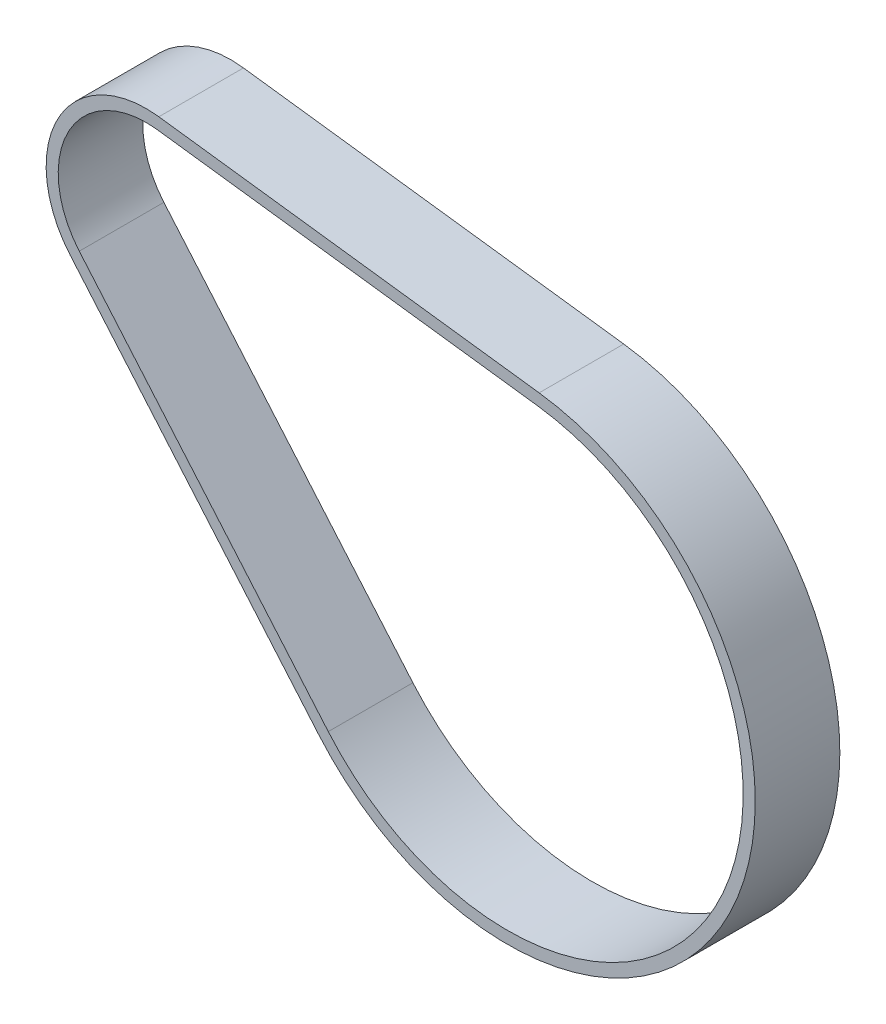
ISO-10303-21;
HEADER;
FILE_DESCRIPTION(('STEP AP214'),'2;1');
FILE_NAME('part.step','',(''),(''),'','','');
FILE_SCHEMA(('AUTOMOTIVE_DESIGN { 1 0 10303 214 1 1 1 1 }'));
ENDSEC;
DATA;
#1=APPLICATION_CONTEXT('core data for automotive mechanical design processes');
#2=APPLICATION_PROTOCOL_DEFINITION('international standard','automotive_design',2000,#1);
#3=PRODUCT_CONTEXT('',#1,'mechanical');
#4=PRODUCT('Part','Part','',(#3));
#5=PRODUCT_RELATED_PRODUCT_CATEGORY('part','',(#4));
#6=PRODUCT_DEFINITION_FORMATION('','',#4);
#7=PRODUCT_DEFINITION_CONTEXT('part definition',#1,'design');
#8=PRODUCT_DEFINITION('design','',#6,#7);
#9=PRODUCT_DEFINITION_SHAPE('','',#8);
#10=(LENGTH_UNIT() NAMED_UNIT(*) SI_UNIT(.MILLI.,.METRE.));
#11=(NAMED_UNIT(*) PLANE_ANGLE_UNIT() SI_UNIT($,.RADIAN.));
#12=(NAMED_UNIT(*) SI_UNIT($,.STERADIAN.) SOLID_ANGLE_UNIT());
#13=UNCERTAINTY_MEASURE_WITH_UNIT(LENGTH_MEASURE(1.E-05),#10,'distance_accuracy_value','');
#14=(GEOMETRIC_REPRESENTATION_CONTEXT(3) GLOBAL_UNCERTAINTY_ASSIGNED_CONTEXT((#13)) GLOBAL_UNIT_ASSIGNED_CONTEXT((#10,
#11,#12)) REPRESENTATION_CONTEXT('',''));
#15=CARTESIAN_POINT('',(0.,0.,0.));
#16=DIRECTION('',(0.,0.,1.));
#17=DIRECTION('',(1.,0.,0.));
#18=AXIS2_PLACEMENT_3D('',#15,#16,#17);
#19=CARTESIAN_POINT('',(2.61780495734741,20.3321690236258,-7.));
#20=DIRECTION('',(-0.127697802797435,-0.991813123103696,0.));
#21=DIRECTION('',(0.991813123103696,-0.127697802797435,0.));
#22=AXIS2_PLACEMENT_3D('',#19,#20,#21);
#23=PLANE('',#22);
#24=DIRECTION('',(0.991813123103696,-0.127697802797435,0.));
#25=VECTOR('',#24,1.);
#26=CARTESIAN_POINT('',(2.61780495734741,20.3321690236258,0.));
#27=LINE('',#26,#25);
#28=CARTESIAN_POINT('',(-28.8467078496831,24.3832841560573,0.));
#29=VERTEX_POINT('',#28);
#30=CARTESIAN_POINT('',(2.61780495734742,20.3321690236258,0.));
#31=VERTEX_POINT('',#30);
#32=EDGE_CURVE('E151',#29,#31,#27,.T.);
#33=ORIENTED_EDGE('',*,*,#32,.T.);
#34=DIRECTION('',(0.,0.,1.));
#35=VECTOR('',#34,1.);
#36=CARTESIAN_POINT('',(2.61780495734742,20.3321690236258,-7.));
#37=LINE('',#36,#35);
#38=CARTESIAN_POINT('',(2.61780495734742,20.3321690236258,-7.));
#39=VERTEX_POINT('',#38);
#40=EDGE_CURVE('E11',#39,#31,#37,.T.);
#41=ORIENTED_EDGE('',*,*,#40,.F.);
#42=DIRECTION('',(0.991813123103696,-0.127697802797435,0.));
#43=VECTOR('',#42,1.);
#44=CARTESIAN_POINT('',(2.61780495734741,20.3321690236258,-7.));
#45=LINE('',#44,#43);
#46=CARTESIAN_POINT('',(-28.8467078496831,24.3832841560573,-7.));
#47=VERTEX_POINT('',#46);
#48=EDGE_CURVE('E64',#47,#39,#45,.T.);
#49=ORIENTED_EDGE('',*,*,#48,.F.);
#50=DIRECTION('',(0.,0.,1.));
#51=VECTOR('',#50,1.);
#52=CARTESIAN_POINT('',(-28.8467078496831,24.3832841560573,-7.));
#53=LINE('',#52,#51);
#54=EDGE_CURVE('E127',#47,#29,#53,.T.);
#55=ORIENTED_EDGE('',*,*,#54,.T.);
#56=EDGE_LOOP('',(#33,#41,#49,#55));
#57=FACE_BOUND('',#56,.T.);
#58=ADVANCED_FACE('F45',(#57),#23,.F.);
#59=CARTESIAN_POINT('',(0.,0.,-7.));
#60=DIRECTION('',(0.,0.,1.));
#61=DIRECTION('',(1.,0.,0.));
#62=AXIS2_PLACEMENT_3D('',#59,#60,#61);
#63=CYLINDRICAL_SURFACE('',#62,20.5);
#64=CARTESIAN_POINT('',(0.,0.,0.));
#65=DIRECTION('',(0.,0.,1.));
#66=DIRECTION('',(1.,0.,0.));
#67=AXIS2_PLACEMENT_3D('',#64,#65,#66);
#68=CIRCLE('',#67,20.5);
#69=CARTESIAN_POINT('',(-15.588518883489,-13.3134548115471,0.));
#70=VERTEX_POINT('',#69);
#71=EDGE_CURVE('E156',#70,#31,#68,.T.);
#72=ORIENTED_EDGE('',*,*,#71,.F.);
#73=DIRECTION('',(0.,0.,1.));
#74=VECTOR('',#73,1.);
#75=CARTESIAN_POINT('',(-15.588518883489,-13.3134548115471,-7.));
#76=LINE('',#75,#74);
#77=CARTESIAN_POINT('',(-15.588518883489,-13.3134548115471,-7.));
#78=VERTEX_POINT('',#77);
#79=EDGE_CURVE('E55',#78,#70,#76,.T.);
#80=ORIENTED_EDGE('',*,*,#79,.F.);
#81=CARTESIAN_POINT('',(0.,0.,-7.));
#82=DIRECTION('',(0.,0.,1.));
#83=DIRECTION('',(1.,0.,0.));
#84=AXIS2_PLACEMENT_3D('',#81,#82,#83);
#85=CIRCLE('',#84,20.5);
#86=EDGE_CURVE('E131',#78,#39,#85,.T.);
#87=ORIENTED_EDGE('',*,*,#86,.T.);
#88=ORIENTED_EDGE('',*,*,#40,.T.);
#89=EDGE_LOOP('',(#72,#80,#87,#88));
#90=FACE_BOUND('',#89,.T.);
#91=ADVANCED_FACE('F190',(#90),#63,.T.);
#92=CARTESIAN_POINT('',(-15.588518883489,-13.3134548115471,-7.));
#93=DIRECTION('',(-0.760415555292145,-0.64943682007547,0.));
#94=DIRECTION('',(0.649436820075471,-0.760415555292145,0.));
#95=AXIS2_PLACEMENT_3D('',#92,#93,#94);
#96=PLANE('',#95);
#97=DIRECTION('',(0.649436820075471,-0.760415555292145,0.));
#98=VECTOR('',#97,1.);
#99=CARTESIAN_POINT('',(-15.588518883489,-13.3134548115471,0.));
#100=LINE('',#99,#98);
#101=CARTESIAN_POINT('',(-36.1914053210839,10.8101471259656,0.));
#102=VERTEX_POINT('',#101);
#103=EDGE_CURVE('E122',#102,#70,#100,.T.);
#104=ORIENTED_EDGE('',*,*,#103,.F.);
#105=DIRECTION('',(0.,0.,1.));
#106=VECTOR('',#105,1.);
#107=CARTESIAN_POINT('',(-36.1914053210839,10.8101471259656,-7.));
#108=LINE('',#107,#106);
#109=CARTESIAN_POINT('',(-36.1914053210839,10.8101471259656,-7.));
#110=VERTEX_POINT('',#109);
#111=EDGE_CURVE('E118',#110,#102,#108,.T.);
#112=ORIENTED_EDGE('',*,*,#111,.F.);
#113=DIRECTION('',(0.649436820075471,-0.760415555292145,0.));
#114=VECTOR('',#113,1.);
#115=CARTESIAN_POINT('',(-15.588518883489,-13.3134548115471,-7.));
#116=LINE('',#115,#114);
#117=EDGE_CURVE('E121',#110,#78,#116,.T.);
#118=ORIENTED_EDGE('',*,*,#117,.T.);
#119=ORIENTED_EDGE('',*,*,#79,.T.);
#120=EDGE_LOOP('',(#104,#112,#118,#119));
#121=FACE_BOUND('',#120,.T.);
#122=ADVANCED_FACE('F120',(#121),#96,.T.);
#123=CARTESIAN_POINT('',(-29.9027686788179,16.1809896279897,-7.));
#124=DIRECTION('',(0.,0.,1.));
#125=DIRECTION('',(1.,0.,0.));
#126=AXIS2_PLACEMENT_3D('',#123,#124,#125);
#127=CYLINDRICAL_SURFACE('',#126,7.26999999999999);
#128=CARTESIAN_POINT('',(-29.9027686788179,16.1809896279897,0.));
#129=DIRECTION('',(0.,0.,1.));
#130=DIRECTION('',(1.,0.,0.));
#131=AXIS2_PLACEMENT_3D('',#128,#129,#130);
#132=CIRCLE('',#131,7.26999999999999);
#133=CARTESIAN_POINT('',(-28.9744056524805,23.3914710329536,0.));
#134=VERTEX_POINT('',#133);
#135=CARTESIAN_POINT('',(-35.4309897657917,11.4595839460411,0.));
#136=VERTEX_POINT('',#135);
#137=EDGE_CURVE('E140',#134,#136,#132,.T.);
#138=ORIENTED_EDGE('',*,*,#137,.T.);
#139=DIRECTION('',(0.,0.,1.));
#140=VECTOR('',#139,1.);
#141=CARTESIAN_POINT('',(-35.4309897657917,11.4595839460411,-7.));
#142=LINE('',#141,#140);
#143=CARTESIAN_POINT('',(-35.4309897657917,11.4595839460411,-7.));
#144=VERTEX_POINT('',#143);
#145=EDGE_CURVE('E162',#144,#136,#142,.T.);
#146=ORIENTED_EDGE('',*,*,#145,.F.);
#147=CARTESIAN_POINT('',(-29.9027686788179,16.1809896279897,-7.));
#148=DIRECTION('',(0.,0.,1.));
#149=DIRECTION('',(1.,0.,0.));
#150=AXIS2_PLACEMENT_3D('',#147,#148,#149);
#151=CIRCLE('',#150,7.26999999999999);
#152=CARTESIAN_POINT('',(-28.9744056524805,23.3914710329536,-7.));
#153=VERTEX_POINT('',#152);
#154=EDGE_CURVE('E158',#153,#144,#151,.T.);
#155=ORIENTED_EDGE('',*,*,#154,.F.);
#156=DIRECTION('',(0.,0.,1.));
#157=VECTOR('',#156,1.);
#158=CARTESIAN_POINT('',(-28.9744056524805,23.3914710329536,-7.));
#159=LINE('',#158,#157);
#160=EDGE_CURVE('E49',#153,#134,#159,.T.);
#161=ORIENTED_EDGE('',*,*,#160,.T.);
#162=EDGE_LOOP('',(#138,#146,#155,#161));
#163=FACE_BOUND('',#162,.T.);
#164=ADVANCED_FACE('F47',(#163),#127,.F.);
#165=CARTESIAN_POINT('',(-14.8281033281968,-12.6640179914717,-7.));
#166=DIRECTION('',(-0.760415555292145,-0.649436820075471,0.));
#167=DIRECTION('',(0.649436820075471,-0.760415555292145,0.));
#168=AXIS2_PLACEMENT_3D('',#165,#166,#167);
#169=PLANE('',#168);
#170=DIRECTION('',(0.649436820075471,-0.760415555292145,0.));
#171=VECTOR('',#170,1.);
#172=CARTESIAN_POINT('',(-14.8281033281968,-12.6640179914717,0.));
#173=LINE('',#172,#171);
#174=CARTESIAN_POINT('',(-14.8281033281968,-12.6640179914717,0.));
#175=VERTEX_POINT('',#174);
#176=EDGE_CURVE('E149',#136,#175,#173,.T.);
#177=ORIENTED_EDGE('',*,*,#176,.T.);
#178=DIRECTION('',(0.,0.,1.));
#179=VECTOR('',#178,1.);
#180=CARTESIAN_POINT('',(-14.8281033281968,-12.6640179914717,-7.));
#181=LINE('',#180,#179);
#182=CARTESIAN_POINT('',(-14.8281033281968,-12.6640179914717,-7.));
#183=VERTEX_POINT('',#182);
#184=EDGE_CURVE('E165',#183,#175,#181,.T.);
#185=ORIENTED_EDGE('',*,*,#184,.F.);
#186=DIRECTION('',(0.649436820075471,-0.760415555292145,0.));
#187=VECTOR('',#186,1.);
#188=CARTESIAN_POINT('',(-14.8281033281968,-12.6640179914717,-7.));
#189=LINE('',#188,#187);
#190=EDGE_CURVE('E135',#144,#183,#189,.T.);
#191=ORIENTED_EDGE('',*,*,#190,.F.);
#192=ORIENTED_EDGE('',*,*,#145,.T.);
#193=EDGE_LOOP('',(#177,#185,#191,#192));
#194=FACE_BOUND('',#193,.T.);
#195=ADVANCED_FACE('F186',(#194),#169,.F.);
#196=CARTESIAN_POINT('',(0.,0.,-7.));
#197=DIRECTION('',(0.,0.,1.));
#198=DIRECTION('',(1.,0.,0.));
#199=AXIS2_PLACEMENT_3D('',#196,#197,#198);
#200=CYLINDRICAL_SURFACE('',#199,19.5);
#201=CARTESIAN_POINT('',(0.,0.,0.));
#202=DIRECTION('',(0.,0.,1.));
#203=DIRECTION('',(1.,0.,0.));
#204=AXIS2_PLACEMENT_3D('',#201,#202,#203);
#205=CIRCLE('',#204,19.5);
#206=CARTESIAN_POINT('',(2.49010715454998,19.3403559005221,0.));
#207=VERTEX_POINT('',#206);
#208=EDGE_CURVE('E146',#175,#207,#205,.T.);
#209=ORIENTED_EDGE('',*,*,#208,.T.);
#210=DIRECTION('',(0.,0.,1.));
#211=VECTOR('',#210,1.);
#212=CARTESIAN_POINT('',(2.49010715454998,19.3403559005221,-7.));
#213=LINE('',#212,#211);
#214=CARTESIAN_POINT('',(2.49010715454998,19.3403559005221,-7.));
#215=VERTEX_POINT('',#214);
#216=EDGE_CURVE('E167',#215,#207,#213,.T.);
#217=ORIENTED_EDGE('',*,*,#216,.F.);
#218=CARTESIAN_POINT('',(0.,0.,-7.));
#219=DIRECTION('',(0.,0.,1.));
#220=DIRECTION('',(1.,0.,0.));
#221=AXIS2_PLACEMENT_3D('',#218,#219,#220);
#222=CIRCLE('',#221,19.5);
#223=EDGE_CURVE('E206',#183,#215,#222,.T.);
#224=ORIENTED_EDGE('',*,*,#223,.F.);
#225=ORIENTED_EDGE('',*,*,#184,.T.);
#226=EDGE_LOOP('',(#209,#217,#224,#225));
#227=FACE_BOUND('',#226,.T.);
#228=ADVANCED_FACE('F180',(#227),#200,.F.);
#229=CARTESIAN_POINT('',(2.49010715454998,19.3403559005221,-7.));
#230=DIRECTION('',(-0.127697802797435,-0.991813123103696,0.));
#231=DIRECTION('',(0.991813123103696,-0.127697802797435,0.));
#232=AXIS2_PLACEMENT_3D('',#229,#230,#231);
#233=PLANE('',#232);
#234=DIRECTION('',(0.991813123103696,-0.127697802797435,0.));
#235=VECTOR('',#234,1.);
#236=CARTESIAN_POINT('',(2.49010715454998,19.3403559005221,0.));
#237=LINE('',#236,#235);
#238=EDGE_CURVE('E143',#134,#207,#237,.T.);
#239=ORIENTED_EDGE('',*,*,#238,.F.);
#240=ORIENTED_EDGE('',*,*,#160,.F.);
#241=DIRECTION('',(0.991813123103696,-0.127697802797435,0.));
#242=VECTOR('',#241,1.);
#243=CARTESIAN_POINT('',(2.49010715454998,19.3403559005221,-7.));
#244=LINE('',#243,#242);
#245=EDGE_CURVE('E208',#153,#215,#244,.T.);
#246=ORIENTED_EDGE('',*,*,#245,.T.);
#247=ORIENTED_EDGE('',*,*,#216,.T.);
#248=EDGE_LOOP('',(#239,#240,#246,#247));
#249=FACE_BOUND('',#248,.T.);
#250=ADVANCED_FACE('F178',(#249),#233,.T.);
#251=CARTESIAN_POINT('',(-29.9027686788179,16.1809896279897,-7.));
#252=DIRECTION('',(0.,0.,1.));
#253=DIRECTION('',(1.,0.,0.));
#254=AXIS2_PLACEMENT_3D('',#251,#252,#253);
#255=CYLINDRICAL_SURFACE('',#254,8.26999999999999);
#256=CARTESIAN_POINT('',(-29.9027686788179,16.1809896279897,0.));
#257=DIRECTION('',(0.,0.,1.));
#258=DIRECTION('',(1.,0.,0.));
#259=AXIS2_PLACEMENT_3D('',#256,#257,#258);
#260=CIRCLE('',#259,8.26999999999999);
#261=EDGE_CURVE('E153',#29,#102,#260,.T.);
#262=ORIENTED_EDGE('',*,*,#261,.F.);
#263=ORIENTED_EDGE('',*,*,#54,.F.);
#264=CARTESIAN_POINT('',(-29.9027686788179,16.1809896279897,-7.));
#265=DIRECTION('',(0.,0.,1.));
#266=DIRECTION('',(1.,0.,0.));
#267=AXIS2_PLACEMENT_3D('',#264,#265,#266);
#268=CIRCLE('',#267,8.26999999999999);
#269=EDGE_CURVE('E130',#47,#110,#268,.T.);
#270=ORIENTED_EDGE('',*,*,#269,.T.);
#271=ORIENTED_EDGE('',*,*,#111,.T.);
#272=EDGE_LOOP('',(#262,#263,#270,#271));
#273=FACE_BOUND('',#272,.T.);
#274=ADVANCED_FACE('F133',(#273),#255,.T.);
#275=CARTESIAN_POINT('',(0.,0.,-7.));
#276=DIRECTION('',(0.,0.,1.));
#277=DIRECTION('',(1.,0.,0.));
#278=AXIS2_PLACEMENT_3D('',#275,#276,#277);
#279=PLANE('',#278);
#280=ORIENTED_EDGE('',*,*,#154,.T.);
#281=ORIENTED_EDGE('',*,*,#190,.T.);
#282=ORIENTED_EDGE('',*,*,#223,.T.);
#283=ORIENTED_EDGE('',*,*,#245,.F.);
#284=EDGE_LOOP('',(#280,#281,#282,#283));
#285=FACE_BOUND('',#284,.T.);
#286=ORIENTED_EDGE('',*,*,#48,.T.);
#287=ORIENTED_EDGE('',*,*,#86,.F.);
#288=ORIENTED_EDGE('',*,*,#117,.F.);
#289=ORIENTED_EDGE('',*,*,#269,.F.);
#290=EDGE_LOOP('',(#286,#287,#288,#289));
#291=FACE_BOUND('',#290,.T.);
#292=ADVANCED_FACE('F129',(#285,#291),#279,.F.);
#293=CARTESIAN_POINT('',(0.,0.,0.));
#294=DIRECTION('',(0.,0.,1.));
#295=DIRECTION('',(1.,0.,0.));
#296=AXIS2_PLACEMENT_3D('',#293,#294,#295);
#297=PLANE('',#296);
#298=ORIENTED_EDGE('',*,*,#137,.F.);
#299=ORIENTED_EDGE('',*,*,#238,.T.);
#300=ORIENTED_EDGE('',*,*,#208,.F.);
#301=ORIENTED_EDGE('',*,*,#176,.F.);
#302=EDGE_LOOP('',(#298,#299,#300,#301));
#303=FACE_BOUND('',#302,.T.);
#304=ORIENTED_EDGE('',*,*,#32,.F.);
#305=ORIENTED_EDGE('',*,*,#261,.T.);
#306=ORIENTED_EDGE('',*,*,#103,.T.);
#307=ORIENTED_EDGE('',*,*,#71,.T.);
#308=EDGE_LOOP('',(#304,#305,#306,#307));
#309=FACE_BOUND('',#308,.T.);
#310=ADVANCED_FACE('F175',(#303,#309),#297,.T.);
#311=CLOSED_SHELL('',(#58,#91,#122,#164,#195,#228,#250,#274,#292,#310));
#312=MANIFOLD_SOLID_BREP('B2',#311);
#313=ADVANCED_BREP_SHAPE_REPRESENTATION('',(#18,#312),#14);
#314=SHAPE_DEFINITION_REPRESENTATION(#9,#313);
ENDSEC;
END-ISO-10303-21;
